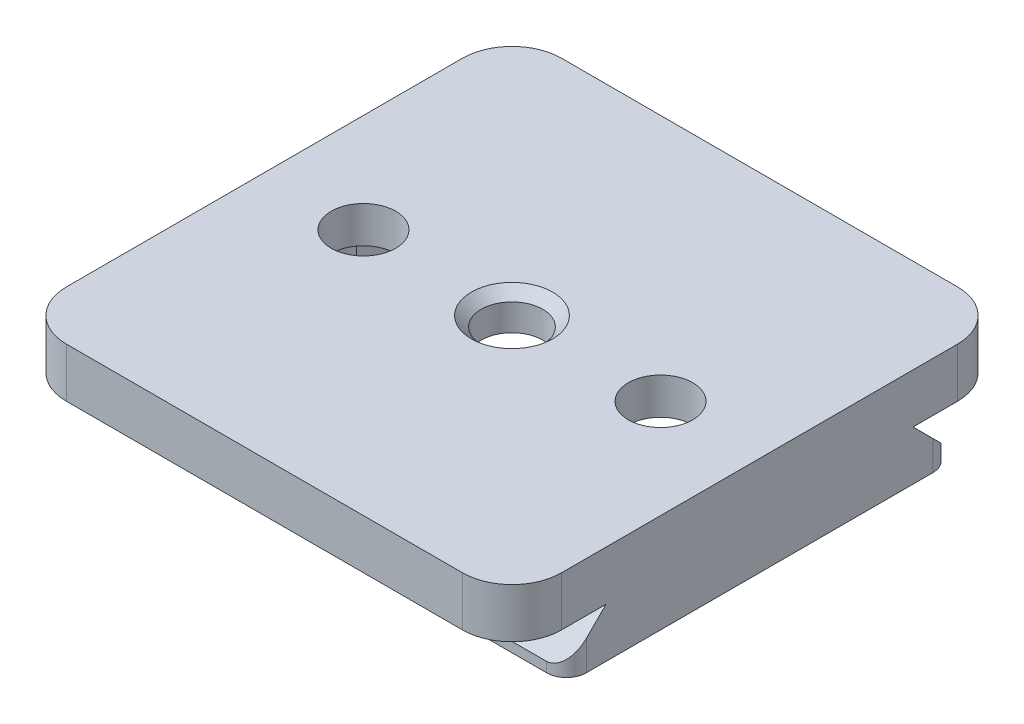
ISO-10303-21;
HEADER;
FILE_DESCRIPTION(('STEP AP214'),'2;1');
FILE_NAME('part.step','',(''),(''),'','','');
FILE_SCHEMA(('AUTOMOTIVE_DESIGN { 1 0 10303 214 1 1 1 1 }'));
ENDSEC;
DATA;
#1=APPLICATION_CONTEXT('core data for automotive mechanical design processes');
#2=APPLICATION_PROTOCOL_DEFINITION('international standard','automotive_design',2000,#1);
#3=PRODUCT_CONTEXT('',#1,'mechanical');
#4=PRODUCT('Part','Part','',(#3));
#5=PRODUCT_RELATED_PRODUCT_CATEGORY('part','',(#4));
#6=PRODUCT_DEFINITION_FORMATION('','',#4);
#7=PRODUCT_DEFINITION_CONTEXT('part definition',#1,'design');
#8=PRODUCT_DEFINITION('design','',#6,#7);
#9=PRODUCT_DEFINITION_SHAPE('','',#8);
#10=(LENGTH_UNIT() NAMED_UNIT(*) SI_UNIT(.MILLI.,.METRE.));
#11=(NAMED_UNIT(*) PLANE_ANGLE_UNIT() SI_UNIT($,.RADIAN.));
#12=(NAMED_UNIT(*) SI_UNIT($,.STERADIAN.) SOLID_ANGLE_UNIT());
#13=UNCERTAINTY_MEASURE_WITH_UNIT(LENGTH_MEASURE(1.E-05),#10,'distance_accuracy_value','');
#14=(GEOMETRIC_REPRESENTATION_CONTEXT(3) GLOBAL_UNCERTAINTY_ASSIGNED_CONTEXT((#13)) GLOBAL_UNIT_ASSIGNED_CONTEXT((#10,
#11,#12)) REPRESENTATION_CONTEXT('',''));
#15=CARTESIAN_POINT('',(0.,0.,0.));
#16=DIRECTION('',(0.,0.,1.));
#17=DIRECTION('',(1.,0.,0.));
#18=AXIS2_PLACEMENT_3D('',#15,#16,#17);
#19=CARTESIAN_POINT('',(21.,6.3,7.22841614740048));
#20=DIRECTION('',(1.,0.,0.));
#21=DIRECTION('',(0.,0.,-1.));
#22=AXIS2_PLACEMENT_3D('',#19,#20,#21);
#23=PLANE('',#22);
#24=DIRECTION('',(0.,1.,0.));
#25=VECTOR('',#24,1.);
#26=CARTESIAN_POINT('',(21.,-3.7,-5.29150262212918));
#27=LINE('',#26,#25);
#28=CARTESIAN_POINT('',(21.,6.3,-5.29150262212918));
#29=VERTEX_POINT('',#28);
#30=CARTESIAN_POINT('',(21.,0.,-5.29150262212919));
#31=VERTEX_POINT('',#30);
#32=EDGE_CURVE('E11',#29,#31,#27,.F.);
#33=ORIENTED_EDGE('',*,*,#32,.F.);
#34=DIRECTION('',(0.,0.,1.));
#35=VECTOR('',#34,1.);
#36=CARTESIAN_POINT('',(21.,6.3,-10.5));
#37=LINE('',#36,#35);
#38=CARTESIAN_POINT('',(21.,6.3,-10.5));
#39=VERTEX_POINT('',#38);
#40=EDGE_CURVE('E263',#39,#29,#37,.T.);
#41=ORIENTED_EDGE('',*,*,#40,.F.);
#42=DIRECTION('',(0.,-1.,0.));
#43=VECTOR('',#42,1.);
#44=CARTESIAN_POINT('',(21.,6.3,-10.5));
#45=LINE('',#44,#43);
#46=CARTESIAN_POINT('',(21.,0.,-10.5));
#47=VERTEX_POINT('',#46);
#48=EDGE_CURVE('E295',#39,#47,#45,.T.);
#49=ORIENTED_EDGE('',*,*,#48,.T.);
#50=DIRECTION('',(0.,0.,1.));
#51=VECTOR('',#50,1.);
#52=CARTESIAN_POINT('',(21.,0.,-10.5));
#53=LINE('',#52,#51);
#54=EDGE_CURVE('E287',#47,#31,#53,.T.);
#55=ORIENTED_EDGE('',*,*,#54,.T.);
#56=EDGE_LOOP('',(#33,#41,#49,#55));
#57=FACE_BOUND('',#56,.T.);
#58=ADVANCED_FACE('F33',(#57),#23,.F.);
#59=DIRECTION('',(0.,1.,0.));
#60=VECTOR('',#59,1.);
#61=CARTESIAN_POINT('',(21.,-3.7,5.29150262212918));
#62=LINE('',#61,#60);
#63=CARTESIAN_POINT('',(21.,0.,5.29150262212918));
#64=VERTEX_POINT('',#63);
#65=CARTESIAN_POINT('',(21.,6.3,5.29150262212918));
#66=VERTEX_POINT('',#65);
#67=EDGE_CURVE('E41',#64,#66,#62,.T.);
#68=ORIENTED_EDGE('',*,*,#67,.F.);
#69=CARTESIAN_POINT('',(21.,0.,10.5));
#70=VERTEX_POINT('',#69);
#71=EDGE_CURVE('E286',#64,#70,#53,.T.);
#72=ORIENTED_EDGE('',*,*,#71,.T.);
#73=DIRECTION('',(0.,-1.,0.));
#74=VECTOR('',#73,1.);
#75=CARTESIAN_POINT('',(21.,6.3,10.5));
#76=LINE('',#75,#74);
#77=CARTESIAN_POINT('',(21.,6.3,10.5));
#78=VERTEX_POINT('',#77);
#79=EDGE_CURVE('E291',#78,#70,#76,.T.);
#80=ORIENTED_EDGE('',*,*,#79,.F.);
#81=EDGE_CURVE('E262',#66,#78,#37,.T.);
#82=ORIENTED_EDGE('',*,*,#81,.F.);
#83=EDGE_LOOP('',(#68,#72,#80,#82));
#84=FACE_BOUND('',#83,.T.);
#85=ADVANCED_FACE('F432',(#84),#23,.F.);
#86=CARTESIAN_POINT('',(-21.,6.3,-10.5));
#87=DIRECTION('',(-1.,0.,0.));
#88=DIRECTION('',(0.,0.,1.));
#89=AXIS2_PLACEMENT_3D('',#86,#87,#88);
#90=PLANE('',#89);
#91=DIRECTION('',(0.,1.,0.));
#92=VECTOR('',#91,1.);
#93=CARTESIAN_POINT('',(-21.,-3.7,5.29150262212917));
#94=LINE('',#93,#92);
#95=CARTESIAN_POINT('',(-21.,6.3,5.29150262212917));
#96=VERTEX_POINT('',#95);
#97=CARTESIAN_POINT('',(-21.,0.,5.29150262212918));
#98=VERTEX_POINT('',#97);
#99=EDGE_CURVE('E228',#96,#98,#94,.F.);
#100=ORIENTED_EDGE('',*,*,#99,.F.);
#101=DIRECTION('',(0.,0.,-1.));
#102=VECTOR('',#101,1.);
#103=CARTESIAN_POINT('',(-21.,6.3,7.22841614740048));
#104=LINE('',#103,#102);
#105=CARTESIAN_POINT('',(-21.,6.3,10.5));
#106=VERTEX_POINT('',#105);
#107=EDGE_CURVE('E238',#106,#96,#104,.T.);
#108=ORIENTED_EDGE('',*,*,#107,.F.);
#109=DIRECTION('',(0.,-1.,0.));
#110=VECTOR('',#109,1.);
#111=CARTESIAN_POINT('',(-21.,6.3,10.5));
#112=LINE('',#111,#110);
#113=CARTESIAN_POINT('',(-21.,0.,10.5));
#114=VERTEX_POINT('',#113);
#115=EDGE_CURVE('E304',#106,#114,#112,.T.);
#116=ORIENTED_EDGE('',*,*,#115,.T.);
#117=DIRECTION('',(0.,0.,-1.));
#118=VECTOR('',#117,1.);
#119=CARTESIAN_POINT('',(-21.,0.,7.22841614740048));
#120=LINE('',#119,#118);
#121=EDGE_CURVE('E241',#114,#98,#120,.T.);
#122=ORIENTED_EDGE('',*,*,#121,.T.);
#123=EDGE_LOOP('',(#100,#108,#116,#122));
#124=FACE_BOUND('',#123,.T.);
#125=ADVANCED_FACE('F237',(#124),#90,.F.);
#126=DIRECTION('',(0.,1.,0.));
#127=VECTOR('',#126,1.);
#128=CARTESIAN_POINT('',(-21.,-3.7,-5.29150262212918));
#129=LINE('',#128,#127);
#130=CARTESIAN_POINT('',(-21.,0.,-5.29150262212918));
#131=VERTEX_POINT('',#130);
#132=CARTESIAN_POINT('',(-21.,6.3,-5.29150262212918));
#133=VERTEX_POINT('',#132);
#134=EDGE_CURVE('E231',#131,#133,#129,.T.);
#135=ORIENTED_EDGE('',*,*,#134,.F.);
#136=CARTESIAN_POINT('',(-21.,0.,-10.5));
#137=VERTEX_POINT('',#136);
#138=EDGE_CURVE('E275',#131,#137,#120,.T.);
#139=ORIENTED_EDGE('',*,*,#138,.T.);
#140=DIRECTION('',(0.,-1.,0.));
#141=VECTOR('',#140,1.);
#142=CARTESIAN_POINT('',(-21.,6.3,-10.5));
#143=LINE('',#142,#141);
#144=CARTESIAN_POINT('',(-21.,6.3,-10.5));
#145=VERTEX_POINT('',#144);
#146=EDGE_CURVE('E301',#145,#137,#143,.T.);
#147=ORIENTED_EDGE('',*,*,#146,.F.);
#148=EDGE_CURVE('E249',#133,#145,#104,.T.);
#149=ORIENTED_EDGE('',*,*,#148,.F.);
#150=EDGE_LOOP('',(#135,#139,#147,#149));
#151=FACE_BOUND('',#150,.T.);
#152=ADVANCED_FACE('F487',(#151),#90,.F.);
#153=CARTESIAN_POINT('',(18.5,6.3,10.5));
#154=DIRECTION('',(0.,-1.,0.));
#155=DIRECTION('',(0.,0.,-1.));
#156=AXIS2_PLACEMENT_3D('',#153,#154,#155);
#157=PLANE('',#156);
#158=CARTESIAN_POINT('',(0.,6.3,0.));
#159=DIRECTION('',(0.,-1.,0.));
#160=DIRECTION('',(0.,0.,-1.));
#161=AXIS2_PLACEMENT_3D('',#158,#159,#160);
#162=CIRCLE('',#161,3.1);
#163=CARTESIAN_POINT('',(0.,6.3,-3.1));
#164=VERTEX_POINT('',#163);
#165=EDGE_CURVE('E417',#164,#164,#162,.T.);
#166=ORIENTED_EDGE('',*,*,#165,.F.);
#167=EDGE_LOOP('',(#166));
#168=FACE_BOUND('',#167,.T.);
#169=ORIENTED_EDGE('',*,*,#40,.T.);
#170=CARTESIAN_POINT('',(15.,6.3,0.));
#171=DIRECTION('',(0.,-1.,0.));
#172=DIRECTION('',(0.,0.,-1.));
#173=AXIS2_PLACEMENT_3D('',#170,#171,#172);
#174=CIRCLE('',#173,8.);
#175=EDGE_CURVE('E48',#29,#66,#174,.T.);
#176=ORIENTED_EDGE('',*,*,#175,.T.);
#177=ORIENTED_EDGE('',*,*,#81,.T.);
#178=CARTESIAN_POINT('',(18.5,6.3,10.5));
#179=DIRECTION('',(0.,-1.,0.));
#180=DIRECTION('',(0.,0.,-1.));
#181=AXIS2_PLACEMENT_3D('',#178,#179,#180);
#182=CIRCLE('',#181,2.5);
#183=CARTESIAN_POINT('',(18.5,6.3,13.));
#184=VERTEX_POINT('',#183);
#185=EDGE_CURVE('E290',#78,#184,#182,.T.);
#186=ORIENTED_EDGE('',*,*,#185,.T.);
#187=DIRECTION('',(-1.,0.,0.));
#188=VECTOR('',#187,1.);
#189=CARTESIAN_POINT('',(18.5,6.3,13.));
#190=LINE('',#189,#188);
#191=CARTESIAN_POINT('',(-18.5,6.3,13.));
#192=VERTEX_POINT('',#191);
#193=EDGE_CURVE('E436',#184,#192,#190,.T.);
#194=ORIENTED_EDGE('',*,*,#193,.T.);
#195=CARTESIAN_POINT('',(-18.5,6.3,10.5));
#196=DIRECTION('',(0.,-1.,0.));
#197=DIRECTION('',(0.,0.,-1.));
#198=AXIS2_PLACEMENT_3D('',#195,#196,#197);
#199=CIRCLE('',#198,2.5);
#200=EDGE_CURVE('E247',#192,#106,#199,.T.);
#201=ORIENTED_EDGE('',*,*,#200,.T.);
#202=ORIENTED_EDGE('',*,*,#107,.T.);
#203=CARTESIAN_POINT('',(-15.,6.3,0.));
#204=DIRECTION('',(0.,-1.,0.));
#205=DIRECTION('',(0.,0.,-1.));
#206=AXIS2_PLACEMENT_3D('',#203,#204,#205);
#207=CIRCLE('',#206,8.);
#208=EDGE_CURVE('E55',#96,#133,#207,.T.);
#209=ORIENTED_EDGE('',*,*,#208,.T.);
#210=ORIENTED_EDGE('',*,*,#148,.T.);
#211=CARTESIAN_POINT('',(-18.5,6.3,-10.5));
#212=DIRECTION('',(0.,-1.,0.));
#213=DIRECTION('',(0.,0.,1.));
#214=AXIS2_PLACEMENT_3D('',#211,#212,#213);
#215=CIRCLE('',#214,2.5);
#216=CARTESIAN_POINT('',(-18.5,6.3,-13.));
#217=VERTEX_POINT('',#216);
#218=EDGE_CURVE('E248',#145,#217,#215,.T.);
#219=ORIENTED_EDGE('',*,*,#218,.T.);
#220=DIRECTION('',(1.,0.,0.));
#221=VECTOR('',#220,1.);
#222=CARTESIAN_POINT('',(18.5,6.3,-13.));
#223=LINE('',#222,#221);
#224=CARTESIAN_POINT('',(18.5,6.3,-13.));
#225=VERTEX_POINT('',#224);
#226=EDGE_CURVE('E252',#217,#225,#223,.T.);
#227=ORIENTED_EDGE('',*,*,#226,.T.);
#228=CARTESIAN_POINT('',(18.5,6.3,-10.5));
#229=DIRECTION('',(0.,-1.,0.));
#230=DIRECTION('',(0.,0.,-1.));
#231=AXIS2_PLACEMENT_3D('',#228,#229,#230);
#232=CIRCLE('',#231,2.5);
#233=EDGE_CURVE('E259',#225,#39,#232,.T.);
#234=ORIENTED_EDGE('',*,*,#233,.T.);
#235=EDGE_LOOP('',(#169,#176,#177,#186,#194,#201,#202,#209,#210,#219,#227,#234));
#236=FACE_BOUND('',#235,.T.);
#237=CARTESIAN_POINT('',(-15.,6.3,0.));
#238=DIRECTION('',(0.,-1.,0.));
#239=DIRECTION('',(0.,0.,-1.));
#240=AXIS2_PLACEMENT_3D('',#237,#238,#239);
#241=CIRCLE('',#240,3.25);
#242=CARTESIAN_POINT('',(-15.,6.3,-3.25));
#243=VERTEX_POINT('',#242);
#244=EDGE_CURVE('E475',#243,#243,#241,.T.);
#245=ORIENTED_EDGE('',*,*,#244,.F.);
#246=EDGE_LOOP('',(#245));
#247=FACE_BOUND('',#246,.T.);
#248=CARTESIAN_POINT('',(15.,6.3,0.));
#249=DIRECTION('',(0.,-1.,0.));
#250=DIRECTION('',(0.,0.,-1.));
#251=AXIS2_PLACEMENT_3D('',#248,#249,#250);
#252=CIRCLE('',#251,3.25);
#253=CARTESIAN_POINT('',(15.,6.3,-3.25));
#254=VERTEX_POINT('',#253);
#255=EDGE_CURVE('E476',#254,#254,#252,.T.);
#256=ORIENTED_EDGE('',*,*,#255,.F.);
#257=EDGE_LOOP('',(#256));
#258=FACE_BOUND('',#257,.T.);
#259=ADVANCED_FACE('F243',(#168,#236,#247,#258),#157,.T.);
#260=CARTESIAN_POINT('',(0.,5.8,0.));
#261=DIRECTION('',(0.,1.,0.));
#262=DIRECTION('',(0.,0.,1.));
#263=AXIS2_PLACEMENT_3D('',#260,#261,#262);
#264=CYLINDRICAL_SURFACE('',#263,3.1);
#265=CARTESIAN_POINT('',(0.,8.99999999999999,0.));
#266=DIRECTION('',(0.,1.,0.));
#267=DIRECTION('',(0.,0.,1.));
#268=AXIS2_PLACEMENT_3D('',#265,#266,#267);
#269=CIRCLE('',#268,3.1);
#270=CARTESIAN_POINT('',(0.,8.99999999999999,3.1));
#271=VERTEX_POINT('',#270);
#272=EDGE_CURVE('E414',#271,#271,#269,.T.);
#273=ORIENTED_EDGE('',*,*,#272,.T.);
#274=EDGE_LOOP('',(#273));
#275=FACE_BOUND('',#274,.T.);
#276=ORIENTED_EDGE('',*,*,#165,.T.);
#277=EDGE_LOOP('',(#276));
#278=FACE_BOUND('',#277,.T.);
#279=ADVANCED_FACE('F542',(#275,#278),#264,.F.);
#280=CARTESIAN_POINT('',(-25.,10.,25.));
#281=DIRECTION('',(1.,0.,0.));
#282=DIRECTION('',(0.,0.,-1.));
#283=AXIS2_PLACEMENT_3D('',#280,#281,#282);
#284=PLANE('',#283);
#285=DIRECTION('',(0.,0.,1.));
#286=VECTOR('',#285,1.);
#287=CARTESIAN_POINT('',(-25.,0.,25.));
#288=LINE('',#287,#286);
#289=CARTESIAN_POINT('',(-25.,0.,-17.5));
#290=VERTEX_POINT('',#289);
#291=CARTESIAN_POINT('',(-25.,0.,17.5));
#292=VERTEX_POINT('',#291);
#293=EDGE_CURVE('E294',#290,#292,#288,.T.);
#294=ORIENTED_EDGE('',*,*,#293,.T.);
#295=DIRECTION('',(0.,-1.,0.));
#296=VECTOR('',#295,1.);
#297=CARTESIAN_POINT('',(-25.,1.00000000000001,17.5));
#298=LINE('',#297,#296);
#299=CARTESIAN_POINT('',(-25.,3.00000000000002,17.5));
#300=VERTEX_POINT('',#299);
#301=EDGE_CURVE('E408',#292,#300,#298,.F.);
#302=ORIENTED_EDGE('',*,*,#301,.T.);
#303=DIRECTION('',(0.,0.707106781186549,-0.707106781186546));
#304=VECTOR('',#303,1.);
#305=CARTESIAN_POINT('',(-25.,0.,20.5));
#306=LINE('',#305,#304);
#307=CARTESIAN_POINT('',(-25.,5.,15.5));
#308=VERTEX_POINT('',#307);
#309=EDGE_CURVE('E465',#300,#308,#306,.T.);
#310=ORIENTED_EDGE('',*,*,#309,.T.);
#311=DIRECTION('',(0.,0.,1.));
#312=VECTOR('',#311,1.);
#313=CARTESIAN_POINT('',(-25.,5.,25.));
#314=LINE('',#313,#312);
#315=CARTESIAN_POINT('',(-25.,5.,20.));
#316=VERTEX_POINT('',#315);
#317=EDGE_CURVE('E459',#308,#316,#314,.T.);
#318=ORIENTED_EDGE('',*,*,#317,.T.);
#319=DIRECTION('',(0.,-1.,0.));
#320=VECTOR('',#319,1.);
#321=CARTESIAN_POINT('',(-25.,10.,20.));
#322=LINE('',#321,#320);
#323=CARTESIAN_POINT('',(-25.,10.,20.));
#324=VERTEX_POINT('',#323);
#325=EDGE_CURVE('E347',#316,#324,#322,.F.);
#326=ORIENTED_EDGE('',*,*,#325,.T.);
#327=DIRECTION('',(0.,0.,1.));
#328=VECTOR('',#327,1.);
#329=CARTESIAN_POINT('',(-25.,10.,25.));
#330=LINE('',#329,#328);
#331=CARTESIAN_POINT('',(-25.,10.,-20.));
#332=VERTEX_POINT('',#331);
#333=EDGE_CURVE('E310',#332,#324,#330,.T.);
#334=ORIENTED_EDGE('',*,*,#333,.F.);
#335=DIRECTION('',(0.,-1.,0.));
#336=VECTOR('',#335,1.);
#337=CARTESIAN_POINT('',(-25.,10.,-20.));
#338=LINE('',#337,#336);
#339=CARTESIAN_POINT('',(-25.,5.,-20.));
#340=VERTEX_POINT('',#339);
#341=EDGE_CURVE('E349',#332,#340,#338,.T.);
#342=ORIENTED_EDGE('',*,*,#341,.T.);
#343=DIRECTION('',(0.,0.,1.));
#344=VECTOR('',#343,1.);
#345=CARTESIAN_POINT('',(-25.,5.,-15.5));
#346=LINE('',#345,#344);
#347=CARTESIAN_POINT('',(-25.,5.,-15.5));
#348=VERTEX_POINT('',#347);
#349=EDGE_CURVE('E451',#340,#348,#346,.T.);
#350=ORIENTED_EDGE('',*,*,#349,.T.);
#351=DIRECTION('',(0.,-0.707106781186549,-0.707106781186546));
#352=VECTOR('',#351,1.);
#353=CARTESIAN_POINT('',(-25.,0.,-20.5));
#354=LINE('',#353,#352);
#355=CARTESIAN_POINT('',(-25.,3.00000000000002,-17.5));
#356=VERTEX_POINT('',#355);
#357=EDGE_CURVE('E444',#348,#356,#354,.T.);
#358=ORIENTED_EDGE('',*,*,#357,.T.);
#359=DIRECTION('',(0.,1.,0.));
#360=VECTOR('',#359,1.);
#361=CARTESIAN_POINT('',(-25.,0.,-17.5));
#362=LINE('',#361,#360);
#363=EDGE_CURVE('E405',#356,#290,#362,.F.);
#364=ORIENTED_EDGE('',*,*,#363,.T.);
#365=EDGE_LOOP('',(#294,#302,#310,#318,#326,#334,#342,#350,#358,#364));
#366=FACE_BOUND('',#365,.T.);
#367=ADVANCED_FACE('F547',(#366),#284,.F.);
#368=CARTESIAN_POINT('',(25.,10.,25.));
#369=DIRECTION('',(0.,0.,-1.));
#370=DIRECTION('',(-1.,0.,0.));
#371=AXIS2_PLACEMENT_3D('',#368,#369,#370);
#372=PLANE('',#371);
#373=DIRECTION('',(1.,0.,0.));
#374=VECTOR('',#373,1.);
#375=CARTESIAN_POINT('',(25.,10.,25.));
#376=LINE('',#375,#374);
#377=CARTESIAN_POINT('',(-20.,10.,25.));
#378=VERTEX_POINT('',#377);
#379=CARTESIAN_POINT('',(20.,10.,25.));
#380=VERTEX_POINT('',#379);
#381=EDGE_CURVE('E313',#378,#380,#376,.T.);
#382=ORIENTED_EDGE('',*,*,#381,.F.);
#383=DIRECTION('',(0.,-1.,0.));
#384=VECTOR('',#383,1.);
#385=CARTESIAN_POINT('',(-20.,10.,25.));
#386=LINE('',#385,#384);
#387=CARTESIAN_POINT('',(-20.,5.,25.));
#388=VERTEX_POINT('',#387);
#389=EDGE_CURVE('E354',#378,#388,#386,.T.);
#390=ORIENTED_EDGE('',*,*,#389,.T.);
#391=DIRECTION('',(1.,0.,0.));
#392=VECTOR('',#391,1.);
#393=CARTESIAN_POINT('',(-25.,5.,25.));
#394=LINE('',#393,#392);
#395=CARTESIAN_POINT('',(20.,5.,25.));
#396=VERTEX_POINT('',#395);
#397=EDGE_CURVE('E269',#388,#396,#394,.T.);
#398=ORIENTED_EDGE('',*,*,#397,.T.);
#399=DIRECTION('',(0.,-1.,0.));
#400=VECTOR('',#399,1.);
#401=CARTESIAN_POINT('',(20.,10.,25.));
#402=LINE('',#401,#400);
#403=EDGE_CURVE('E352',#396,#380,#402,.F.);
#404=ORIENTED_EDGE('',*,*,#403,.T.);
#405=EDGE_LOOP('',(#382,#390,#398,#404));
#406=FACE_BOUND('',#405,.T.);
#407=ADVANCED_FACE('F554',(#406),#372,.F.);
#408=CARTESIAN_POINT('',(25.,10.,25.));
#409=DIRECTION('',(-1.,0.,0.));
#410=DIRECTION('',(0.,0.,1.));
#411=AXIS2_PLACEMENT_3D('',#408,#409,#410);
#412=PLANE('',#411);
#413=DIRECTION('',(0.,0.,-1.));
#414=VECTOR('',#413,1.);
#415=CARTESIAN_POINT('',(25.,0.,25.));
#416=LINE('',#415,#414);
#417=CARTESIAN_POINT('',(25.,0.,17.5));
#418=VERTEX_POINT('',#417);
#419=CARTESIAN_POINT('',(25.,0.,-17.5));
#420=VERTEX_POINT('',#419);
#421=EDGE_CURVE('E314',#418,#420,#416,.T.);
#422=ORIENTED_EDGE('',*,*,#421,.T.);
#423=DIRECTION('',(0.,-1.,0.));
#424=VECTOR('',#423,1.);
#425=CARTESIAN_POINT('',(25.,1.00000000000001,-17.5));
#426=LINE('',#425,#424);
#427=CARTESIAN_POINT('',(25.,3.00000000000002,-17.5));
#428=VERTEX_POINT('',#427);
#429=EDGE_CURVE('E376',#420,#428,#426,.F.);
#430=ORIENTED_EDGE('',*,*,#429,.T.);
#431=DIRECTION('',(0.,-0.707106781186549,-0.707106781186546));
#432=VECTOR('',#431,1.);
#433=CARTESIAN_POINT('',(25.,0.,-20.5));
#434=LINE('',#433,#432);
#435=CARTESIAN_POINT('',(25.,5.,-15.5));
#436=VERTEX_POINT('',#435);
#437=EDGE_CURVE('E448',#436,#428,#434,.T.);
#438=ORIENTED_EDGE('',*,*,#437,.F.);
#439=DIRECTION('',(0.,0.,1.));
#440=VECTOR('',#439,1.);
#441=CARTESIAN_POINT('',(25.,5.,-15.5));
#442=LINE('',#441,#440);
#443=CARTESIAN_POINT('',(25.,5.,-20.));
#444=VERTEX_POINT('',#443);
#445=EDGE_CURVE('E420',#444,#436,#442,.T.);
#446=ORIENTED_EDGE('',*,*,#445,.F.);
#447=DIRECTION('',(0.,-1.,0.));
#448=VECTOR('',#447,1.);
#449=CARTESIAN_POINT('',(25.,10.,-20.));
#450=LINE('',#449,#448);
#451=CARTESIAN_POINT('',(25.,10.,-20.));
#452=VERTEX_POINT('',#451);
#453=EDGE_CURVE('E337',#444,#452,#450,.F.);
#454=ORIENTED_EDGE('',*,*,#453,.T.);
#455=DIRECTION('',(0.,0.,-1.));
#456=VECTOR('',#455,1.);
#457=CARTESIAN_POINT('',(25.,10.,25.));
#458=LINE('',#457,#456);
#459=CARTESIAN_POINT('',(25.,10.,20.));
#460=VERTEX_POINT('',#459);
#461=EDGE_CURVE('E317',#460,#452,#458,.T.);
#462=ORIENTED_EDGE('',*,*,#461,.F.);
#463=DIRECTION('',(0.,-1.,0.));
#464=VECTOR('',#463,1.);
#465=CARTESIAN_POINT('',(25.,10.,20.));
#466=LINE('',#465,#464);
#467=CARTESIAN_POINT('',(25.,5.,20.));
#468=VERTEX_POINT('',#467);
#469=EDGE_CURVE('E334',#460,#468,#466,.T.);
#470=ORIENTED_EDGE('',*,*,#469,.T.);
#471=DIRECTION('',(0.,0.,1.));
#472=VECTOR('',#471,1.);
#473=CARTESIAN_POINT('',(25.,5.,25.));
#474=LINE('',#473,#472);
#475=CARTESIAN_POINT('',(25.,5.,15.5));
#476=VERTEX_POINT('',#475);
#477=EDGE_CURVE('E462',#476,#468,#474,.T.);
#478=ORIENTED_EDGE('',*,*,#477,.F.);
#479=DIRECTION('',(0.,0.707106781186549,-0.707106781186546));
#480=VECTOR('',#479,1.);
#481=CARTESIAN_POINT('',(25.,0.,20.5));
#482=LINE('',#481,#480);
#483=CARTESIAN_POINT('',(25.,3.00000000000002,17.5));
#484=VERTEX_POINT('',#483);
#485=EDGE_CURVE('E447',#484,#476,#482,.T.);
#486=ORIENTED_EDGE('',*,*,#485,.F.);
#487=DIRECTION('',(0.,1.,0.));
#488=VECTOR('',#487,1.);
#489=CARTESIAN_POINT('',(25.,0.,17.5));
#490=LINE('',#489,#488);
#491=EDGE_CURVE('E373',#484,#418,#490,.F.);
#492=ORIENTED_EDGE('',*,*,#491,.T.);
#493=EDGE_LOOP('',(#422,#430,#438,#446,#454,#462,#470,#478,#486,#492));
#494=FACE_BOUND('',#493,.T.);
#495=ADVANCED_FACE('F718',(#494),#412,.F.);
#496=CARTESIAN_POINT('',(25.,10.,-25.));
#497=DIRECTION('',(0.,0.,1.));
#498=DIRECTION('',(1.,0.,0.));
#499=AXIS2_PLACEMENT_3D('',#496,#497,#498);
#500=PLANE('',#499);
#501=DIRECTION('',(-1.,0.,0.));
#502=VECTOR('',#501,1.);
#503=CARTESIAN_POINT('',(25.,10.,-25.));
#504=LINE('',#503,#502);
#505=CARTESIAN_POINT('',(20.,10.,-25.));
#506=VERTEX_POINT('',#505);
#507=CARTESIAN_POINT('',(-20.,10.,-25.));
#508=VERTEX_POINT('',#507);
#509=EDGE_CURVE('E320',#506,#508,#504,.T.);
#510=ORIENTED_EDGE('',*,*,#509,.F.);
#511=DIRECTION('',(0.,-1.,0.));
#512=VECTOR('',#511,1.);
#513=CARTESIAN_POINT('',(20.,10.,-25.));
#514=LINE('',#513,#512);
#515=CARTESIAN_POINT('',(20.,5.,-25.));
#516=VERTEX_POINT('',#515);
#517=EDGE_CURVE('E327',#506,#516,#514,.T.);
#518=ORIENTED_EDGE('',*,*,#517,.T.);
#519=DIRECTION('',(1.,0.,0.));
#520=VECTOR('',#519,1.);
#521=CARTESIAN_POINT('',(-25.,5.,-25.));
#522=LINE('',#521,#520);
#523=CARTESIAN_POINT('',(-20.,5.,-25.));
#524=VERTEX_POINT('',#523);
#525=EDGE_CURVE('E443',#524,#516,#522,.T.);
#526=ORIENTED_EDGE('',*,*,#525,.F.);
#527=DIRECTION('',(0.,-1.,0.));
#528=VECTOR('',#527,1.);
#529=CARTESIAN_POINT('',(-20.,10.,-25.));
#530=LINE('',#529,#528);
#531=EDGE_CURVE('E323',#524,#508,#530,.F.);
#532=ORIENTED_EDGE('',*,*,#531,.T.);
#533=EDGE_LOOP('',(#510,#518,#526,#532));
#534=FACE_BOUND('',#533,.T.);
#535=ADVANCED_FACE('F727',(#534),#500,.F.);
#536=CARTESIAN_POINT('',(0.,10.,0.));
#537=DIRECTION('',(0.,1.,0.));
#538=DIRECTION('',(0.,0.,1.));
#539=AXIS2_PLACEMENT_3D('',#536,#537,#538);
#540=PLANE('',#539);
#541=CARTESIAN_POINT('',(-15.,10.,0.));
#542=DIRECTION('',(0.,1.,0.));
#543=DIRECTION('',(0.,0.,1.));
#544=AXIS2_PLACEMENT_3D('',#541,#542,#543);
#545=CIRCLE('',#544,3.25);
#546=CARTESIAN_POINT('',(-15.,10.,3.25));
#547=VERTEX_POINT('',#546);
#548=EDGE_CURVE('E421',#547,#547,#545,.T.);
#549=ORIENTED_EDGE('',*,*,#548,.F.);
#550=EDGE_LOOP('',(#549));
#551=FACE_BOUND('',#550,.T.);
#552=CARTESIAN_POINT('',(15.,10.,0.));
#553=DIRECTION('',(0.,1.,0.));
#554=DIRECTION('',(0.,0.,1.));
#555=AXIS2_PLACEMENT_3D('',#552,#553,#554);
#556=CIRCLE('',#555,3.25);
#557=CARTESIAN_POINT('',(15.,10.,3.25));
#558=VERTEX_POINT('',#557);
#559=EDGE_CURVE('E472',#558,#558,#556,.T.);
#560=ORIENTED_EDGE('',*,*,#559,.F.);
#561=EDGE_LOOP('',(#560));
#562=FACE_BOUND('',#561,.T.);
#563=CARTESIAN_POINT('',(0.,10.,0.));
#564=DIRECTION('',(0.,1.,0.));
#565=DIRECTION('',(0.,0.,1.));
#566=AXIS2_PLACEMENT_3D('',#563,#564,#565);
#567=CIRCLE('',#566,4.10000000000001);
#568=CARTESIAN_POINT('',(0.,10.,4.10000000000001));
#569=VERTEX_POINT('',#568);
#570=EDGE_CURVE('E411',#569,#569,#567,.F.);
#571=ORIENTED_EDGE('',*,*,#570,.T.);
#572=EDGE_LOOP('',(#571));
#573=FACE_BOUND('',#572,.T.);
#574=ORIENTED_EDGE('',*,*,#461,.T.);
#575=CARTESIAN_POINT('',(20.,10.,-20.));
#576=DIRECTION('',(0.,1.,0.));
#577=DIRECTION('',(0.,0.,1.));
#578=AXIS2_PLACEMENT_3D('',#575,#576,#577);
#579=CIRCLE('',#578,5.);
#580=EDGE_CURVE('E345',#452,#506,#579,.T.);
#581=ORIENTED_EDGE('',*,*,#580,.T.);
#582=ORIENTED_EDGE('',*,*,#509,.T.);
#583=CARTESIAN_POINT('',(-20.,10.,-20.));
#584=DIRECTION('',(0.,1.,0.));
#585=DIRECTION('',(0.,0.,1.));
#586=AXIS2_PLACEMENT_3D('',#583,#584,#585);
#587=CIRCLE('',#586,5.);
#588=EDGE_CURVE('E343',#508,#332,#587,.T.);
#589=ORIENTED_EDGE('',*,*,#588,.T.);
#590=ORIENTED_EDGE('',*,*,#333,.T.);
#591=CARTESIAN_POINT('',(-20.,10.,20.));
#592=DIRECTION('',(0.,1.,0.));
#593=DIRECTION('',(0.,0.,1.));
#594=AXIS2_PLACEMENT_3D('',#591,#592,#593);
#595=CIRCLE('',#594,5.);
#596=EDGE_CURVE('E341',#324,#378,#595,.T.);
#597=ORIENTED_EDGE('',*,*,#596,.T.);
#598=ORIENTED_EDGE('',*,*,#381,.T.);
#599=CARTESIAN_POINT('',(20.,10.,20.));
#600=DIRECTION('',(0.,1.,0.));
#601=DIRECTION('',(0.,0.,1.));
#602=AXIS2_PLACEMENT_3D('',#599,#600,#601);
#603=CIRCLE('',#602,5.);
#604=EDGE_CURVE('E339',#380,#460,#603,.T.);
#605=ORIENTED_EDGE('',*,*,#604,.T.);
#606=EDGE_LOOP('',(#574,#581,#582,#589,#590,#597,#598,#605));
#607=FACE_BOUND('',#606,.T.);
#608=ADVANCED_FACE('F731',(#551,#562,#573,#607),#540,.T.);
#609=CARTESIAN_POINT('',(0.,0.,0.));
#610=DIRECTION('',(0.,1.,0.));
#611=DIRECTION('',(0.,0.,1.));
#612=AXIS2_PLACEMENT_3D('',#609,#610,#611);
#613=PLANE('',#612);
#614=CARTESIAN_POINT('',(15.,0.,0.));
#615=DIRECTION('',(0.,1.,0.));
#616=DIRECTION('',(0.,0.,1.));
#617=AXIS2_PLACEMENT_3D('',#614,#615,#616);
#618=CIRCLE('',#617,8.);
#619=EDGE_CURVE('E428',#31,#64,#618,.F.);
#620=ORIENTED_EDGE('',*,*,#619,.F.);
#621=ORIENTED_EDGE('',*,*,#54,.F.);
#622=CARTESIAN_POINT('',(18.5,0.,-10.5));
#623=DIRECTION('',(0.,-1.,0.));
#624=DIRECTION('',(0.,0.,-1.));
#625=AXIS2_PLACEMENT_3D('',#622,#623,#624);
#626=CIRCLE('',#625,2.5);
#627=CARTESIAN_POINT('',(18.5,0.,-13.));
#628=VERTEX_POINT('',#627);
#629=EDGE_CURVE('E283',#628,#47,#626,.T.);
#630=ORIENTED_EDGE('',*,*,#629,.F.);
#631=DIRECTION('',(1.,0.,0.));
#632=VECTOR('',#631,1.);
#633=CARTESIAN_POINT('',(18.5,0.,-13.));
#634=LINE('',#633,#632);
#635=CARTESIAN_POINT('',(-18.5,0.,-13.));
#636=VERTEX_POINT('',#635);
#637=EDGE_CURVE('E280',#636,#628,#634,.T.);
#638=ORIENTED_EDGE('',*,*,#637,.F.);
#639=CARTESIAN_POINT('',(-18.5,0.,-10.5));
#640=DIRECTION('',(0.,-1.,0.));
#641=DIRECTION('',(0.,0.,1.));
#642=AXIS2_PLACEMENT_3D('',#639,#640,#641);
#643=CIRCLE('',#642,2.5);
#644=EDGE_CURVE('E277',#137,#636,#643,.T.);
#645=ORIENTED_EDGE('',*,*,#644,.F.);
#646=ORIENTED_EDGE('',*,*,#138,.F.);
#647=CARTESIAN_POINT('',(-15.,0.,0.));
#648=DIRECTION('',(0.,1.,0.));
#649=DIRECTION('',(0.,0.,1.));
#650=AXIS2_PLACEMENT_3D('',#647,#648,#649);
#651=CIRCLE('',#650,8.);
#652=EDGE_CURVE('E482',#98,#131,#651,.F.);
#653=ORIENTED_EDGE('',*,*,#652,.F.);
#654=ORIENTED_EDGE('',*,*,#121,.F.);
#655=CARTESIAN_POINT('',(-18.5,0.,10.5));
#656=DIRECTION('',(0.,-1.,0.));
#657=DIRECTION('',(0.,0.,-1.));
#658=AXIS2_PLACEMENT_3D('',#655,#656,#657);
#659=CIRCLE('',#658,2.5);
#660=CARTESIAN_POINT('',(-18.5,0.,13.));
#661=VERTEX_POINT('',#660);
#662=EDGE_CURVE('E272',#661,#114,#659,.T.);
#663=ORIENTED_EDGE('',*,*,#662,.F.);
#664=DIRECTION('',(-1.,0.,0.));
#665=VECTOR('',#664,1.);
#666=CARTESIAN_POINT('',(18.5,0.,13.));
#667=LINE('',#666,#665);
#668=CARTESIAN_POINT('',(18.5,0.,13.));
#669=VERTEX_POINT('',#668);
#670=EDGE_CURVE('E268',#669,#661,#667,.T.);
#671=ORIENTED_EDGE('',*,*,#670,.F.);
#672=CARTESIAN_POINT('',(18.5,0.,10.5));
#673=DIRECTION('',(0.,-1.,0.));
#674=DIRECTION('',(0.,0.,-1.));
#675=AXIS2_PLACEMENT_3D('',#672,#673,#674);
#676=CIRCLE('',#675,2.5);
#677=EDGE_CURVE('E266',#70,#669,#676,.T.);
#678=ORIENTED_EDGE('',*,*,#677,.F.);
#679=ORIENTED_EDGE('',*,*,#71,.F.);
#680=EDGE_LOOP('',(#620,#621,#630,#638,#645,#646,#653,#654,#663,#671,#678,#679));
#681=FACE_BOUND('',#680,.T.);
#682=CARTESIAN_POINT('',(-23.,0.,17.5));
#683=DIRECTION('',(0.,1.,0.));
#684=DIRECTION('',(0.,0.,1.));
#685=AXIS2_PLACEMENT_3D('',#682,#683,#684);
#686=CIRCLE('',#685,2.);
#687=CARTESIAN_POINT('',(-23.,0.,19.5));
#688=VERTEX_POINT('',#687);
#689=EDGE_CURVE('E389',#688,#292,#686,.F.);
#690=ORIENTED_EDGE('',*,*,#689,.T.);
#691=ORIENTED_EDGE('',*,*,#293,.F.);
#692=CARTESIAN_POINT('',(-23.,0.,-17.5));
#693=DIRECTION('',(0.,1.,0.));
#694=DIRECTION('',(0.,0.,1.));
#695=AXIS2_PLACEMENT_3D('',#692,#693,#694);
#696=CIRCLE('',#695,2.);
#697=CARTESIAN_POINT('',(-23.,0.,-19.5));
#698=VERTEX_POINT('',#697);
#699=EDGE_CURVE('E387',#290,#698,#696,.F.);
#700=ORIENTED_EDGE('',*,*,#699,.T.);
#701=DIRECTION('',(1.,0.,0.));
#702=VECTOR('',#701,1.);
#703=CARTESIAN_POINT('',(0.,0.,-19.5));
#704=LINE('',#703,#702);
#705=CARTESIAN_POINT('',(23.,0.,-19.5));
#706=VERTEX_POINT('',#705);
#707=EDGE_CURVE('E364',#698,#706,#704,.T.);
#708=ORIENTED_EDGE('',*,*,#707,.T.);
#709=CARTESIAN_POINT('',(23.,0.,-17.5));
#710=DIRECTION('',(0.,1.,0.));
#711=DIRECTION('',(0.,0.,1.));
#712=AXIS2_PLACEMENT_3D('',#709,#710,#711);
#713=CIRCLE('',#712,2.);
#714=EDGE_CURVE('E394',#706,#420,#713,.F.);
#715=ORIENTED_EDGE('',*,*,#714,.T.);
#716=ORIENTED_EDGE('',*,*,#421,.F.);
#717=CARTESIAN_POINT('',(23.,0.,17.5));
#718=DIRECTION('',(0.,1.,0.));
#719=DIRECTION('',(0.,0.,1.));
#720=AXIS2_PLACEMENT_3D('',#717,#718,#719);
#721=CIRCLE('',#720,2.);
#722=CARTESIAN_POINT('',(23.,0.,19.5));
#723=VERTEX_POINT('',#722);
#724=EDGE_CURVE('E392',#418,#723,#721,.F.);
#725=ORIENTED_EDGE('',*,*,#724,.T.);
#726=DIRECTION('',(-1.,0.,0.));
#727=VECTOR('',#726,1.);
#728=CARTESIAN_POINT('',(0.,0.,19.5));
#729=LINE('',#728,#727);
#730=EDGE_CURVE('E367',#723,#688,#729,.T.);
#731=ORIENTED_EDGE('',*,*,#730,.T.);
#732=EDGE_LOOP('',(#690,#691,#700,#708,#715,#716,#725,#731));
#733=FACE_BOUND('',#732,.T.);
#734=ADVANCED_FACE('F490',(#681,#733),#613,.F.);
#735=CARTESIAN_POINT('',(18.5,6.3,10.5));
#736=DIRECTION('',(0.,-1.,0.));
#737=DIRECTION('',(0.,0.,-1.));
#738=AXIS2_PLACEMENT_3D('',#735,#736,#737);
#739=CYLINDRICAL_SURFACE('',#738,2.5);
#740=ORIENTED_EDGE('',*,*,#677,.T.);
#741=DIRECTION('',(0.,-1.,0.));
#742=VECTOR('',#741,1.);
#743=CARTESIAN_POINT('',(18.5,6.3,13.));
#744=LINE('',#743,#742);
#745=EDGE_CURVE('E265',#184,#669,#744,.T.);
#746=ORIENTED_EDGE('',*,*,#745,.F.);
#747=ORIENTED_EDGE('',*,*,#185,.F.);
#748=ORIENTED_EDGE('',*,*,#79,.T.);
#749=EDGE_LOOP('',(#740,#746,#747,#748));
#750=FACE_BOUND('',#749,.T.);
#751=ADVANCED_FACE('F508',(#750),#739,.F.);
#752=CARTESIAN_POINT('',(18.5,6.3,-10.5));
#753=DIRECTION('',(0.,-1.,0.));
#754=DIRECTION('',(0.,0.,-1.));
#755=AXIS2_PLACEMENT_3D('',#752,#753,#754);
#756=CYLINDRICAL_SURFACE('',#755,2.5);
#757=ORIENTED_EDGE('',*,*,#629,.T.);
#758=ORIENTED_EDGE('',*,*,#48,.F.);
#759=ORIENTED_EDGE('',*,*,#233,.F.);
#760=DIRECTION('',(0.,-1.,0.));
#761=VECTOR('',#760,1.);
#762=CARTESIAN_POINT('',(18.5,6.3,-13.));
#763=LINE('',#762,#761);
#764=EDGE_CURVE('E297',#225,#628,#763,.T.);
#765=ORIENTED_EDGE('',*,*,#764,.T.);
#766=EDGE_LOOP('',(#757,#758,#759,#765));
#767=FACE_BOUND('',#766,.T.);
#768=ADVANCED_FACE('F502',(#767),#756,.F.);
#769=CARTESIAN_POINT('',(18.5,6.3,-13.));
#770=DIRECTION('',(0.,0.,-1.));
#771=DIRECTION('',(-1.,0.,0.));
#772=AXIS2_PLACEMENT_3D('',#769,#770,#771);
#773=PLANE('',#772);
#774=ORIENTED_EDGE('',*,*,#637,.T.);
#775=ORIENTED_EDGE('',*,*,#764,.F.);
#776=ORIENTED_EDGE('',*,*,#226,.F.);
#777=DIRECTION('',(0.,-1.,0.));
#778=VECTOR('',#777,1.);
#779=CARTESIAN_POINT('',(-18.5,6.3,-13.));
#780=LINE('',#779,#778);
#781=EDGE_CURVE('E299',#217,#636,#780,.T.);
#782=ORIENTED_EDGE('',*,*,#781,.T.);
#783=EDGE_LOOP('',(#774,#775,#776,#782));
#784=FACE_BOUND('',#783,.T.);
#785=ADVANCED_FACE('F500',(#784),#773,.F.);
#786=CARTESIAN_POINT('',(-18.5,6.3,-10.5));
#787=DIRECTION('',(0.,-1.,0.));
#788=DIRECTION('',(0.,0.,-1.));
#789=AXIS2_PLACEMENT_3D('',#786,#787,#788);
#790=CYLINDRICAL_SURFACE('',#789,2.5);
#791=ORIENTED_EDGE('',*,*,#644,.T.);
#792=ORIENTED_EDGE('',*,*,#781,.F.);
#793=ORIENTED_EDGE('',*,*,#218,.F.);
#794=ORIENTED_EDGE('',*,*,#146,.T.);
#795=EDGE_LOOP('',(#791,#792,#793,#794));
#796=FACE_BOUND('',#795,.T.);
#797=ADVANCED_FACE('F495',(#796),#790,.F.);
#798=CARTESIAN_POINT('',(-18.5,6.3,10.5));
#799=DIRECTION('',(0.,-1.,0.));
#800=DIRECTION('',(0.,0.,-1.));
#801=AXIS2_PLACEMENT_3D('',#798,#799,#800);
#802=CYLINDRICAL_SURFACE('',#801,2.5);
#803=ORIENTED_EDGE('',*,*,#662,.T.);
#804=ORIENTED_EDGE('',*,*,#115,.F.);
#805=ORIENTED_EDGE('',*,*,#200,.F.);
#806=DIRECTION('',(0.,-1.,0.));
#807=VECTOR('',#806,1.);
#808=CARTESIAN_POINT('',(-18.5,6.3,13.));
#809=LINE('',#808,#807);
#810=EDGE_CURVE('E306',#192,#661,#809,.T.);
#811=ORIENTED_EDGE('',*,*,#810,.T.);
#812=EDGE_LOOP('',(#803,#804,#805,#811));
#813=FACE_BOUND('',#812,.T.);
#814=ADVANCED_FACE('F513',(#813),#802,.F.);
#815=CARTESIAN_POINT('',(18.5,6.3,13.));
#816=DIRECTION('',(0.,0.,1.));
#817=DIRECTION('',(1.,0.,0.));
#818=AXIS2_PLACEMENT_3D('',#815,#816,#817);
#819=PLANE('',#818);
#820=ORIENTED_EDGE('',*,*,#670,.T.);
#821=ORIENTED_EDGE('',*,*,#810,.F.);
#822=ORIENTED_EDGE('',*,*,#193,.F.);
#823=ORIENTED_EDGE('',*,*,#745,.T.);
#824=EDGE_LOOP('',(#820,#821,#822,#823));
#825=FACE_BOUND('',#824,.T.);
#826=ADVANCED_FACE('F510',(#825),#819,.F.);
#827=CARTESIAN_POINT('',(-25.,5.,-15.5));
#828=DIRECTION('',(0.,1.,0.));
#829=DIRECTION('',(0.,0.,1.));
#830=AXIS2_PLACEMENT_3D('',#827,#828,#829);
#831=PLANE('',#830);
#832=ORIENTED_EDGE('',*,*,#525,.T.);
#833=CARTESIAN_POINT('',(20.,5.,-20.));
#834=DIRECTION('',(0.,1.,0.));
#835=DIRECTION('',(0.,0.,1.));
#836=AXIS2_PLACEMENT_3D('',#833,#834,#835);
#837=CIRCLE('',#836,5.);
#838=EDGE_CURVE('E332',#516,#444,#837,.F.);
#839=ORIENTED_EDGE('',*,*,#838,.T.);
#840=ORIENTED_EDGE('',*,*,#445,.T.);
#841=DIRECTION('',(1.,0.,0.));
#842=VECTOR('',#841,1.);
#843=CARTESIAN_POINT('',(-25.,5.,-15.5));
#844=LINE('',#843,#842);
#845=EDGE_CURVE('E440',#348,#436,#844,.T.);
#846=ORIENTED_EDGE('',*,*,#845,.F.);
#847=ORIENTED_EDGE('',*,*,#349,.F.);
#848=CARTESIAN_POINT('',(-20.,5.,-20.));
#849=DIRECTION('',(0.,1.,0.));
#850=DIRECTION('',(0.,0.,1.));
#851=AXIS2_PLACEMENT_3D('',#848,#849,#850);
#852=CIRCLE('',#851,5.);
#853=EDGE_CURVE('E330',#340,#524,#852,.F.);
#854=ORIENTED_EDGE('',*,*,#853,.T.);
#855=EDGE_LOOP('',(#832,#839,#840,#846,#847,#854));
#856=FACE_BOUND('',#855,.T.);
#857=ADVANCED_FACE('F520',(#856),#831,.F.);
#858=CARTESIAN_POINT('',(-25.,0.,-20.5));
#859=DIRECTION('',(0.,-0.707106781186546,0.707106781186549));
#860=DIRECTION('',(0.,-0.707106781186549,-0.707106781186546));
#861=AXIS2_PLACEMENT_3D('',#858,#859,#860);
#862=PLANE('',#861);
#863=ORIENTED_EDGE('',*,*,#437,.T.);
#864=CARTESIAN_POINT('',(23.,3.00000000000002,-17.5));
#865=DIRECTION('',(0.,-0.707106781186546,0.707106781186549));
#866=DIRECTION('',(0.,0.707106781186549,0.707106781186546));
#867=AXIS2_PLACEMENT_3D('',#864,#865,#866);
#868=ELLIPSE('',#867,2.8284271247462,2.);
#869=CARTESIAN_POINT('',(23.,1.00000000000001,-19.5));
#870=VERTEX_POINT('',#869);
#871=EDGE_CURVE('E381',#428,#870,#868,.F.);
#872=ORIENTED_EDGE('',*,*,#871,.T.);
#873=DIRECTION('',(-1.,0.,0.));
#874=VECTOR('',#873,1.);
#875=CARTESIAN_POINT('',(-25.,1.00000000000001,-19.5));
#876=LINE('',#875,#874);
#877=CARTESIAN_POINT('',(-23.,1.00000000000001,-19.5));
#878=VERTEX_POINT('',#877);
#879=EDGE_CURVE('E370',#870,#878,#876,.T.);
#880=ORIENTED_EDGE('',*,*,#879,.T.);
#881=CARTESIAN_POINT('',(-23.,3.00000000000002,-17.5));
#882=DIRECTION('',(0.,-0.707106781186546,0.707106781186549));
#883=DIRECTION('',(0.,-0.707106781186549,-0.707106781186546));
#884=AXIS2_PLACEMENT_3D('',#881,#882,#883);
#885=ELLIPSE('',#884,2.8284271247462,2.);
#886=EDGE_CURVE('E379',#878,#356,#885,.F.);
#887=ORIENTED_EDGE('',*,*,#886,.T.);
#888=ORIENTED_EDGE('',*,*,#357,.F.);
#889=ORIENTED_EDGE('',*,*,#845,.T.);
#890=EDGE_LOOP('',(#863,#872,#880,#887,#888,#889));
#891=FACE_BOUND('',#890,.T.);
#892=ADVANCED_FACE('F560',(#891),#862,.F.);
#893=CARTESIAN_POINT('',(-25.,5.,25.));
#894=DIRECTION('',(0.,1.,0.));
#895=DIRECTION('',(0.,0.,1.));
#896=AXIS2_PLACEMENT_3D('',#893,#894,#895);
#897=PLANE('',#896);
#898=ORIENTED_EDGE('',*,*,#397,.F.);
#899=CARTESIAN_POINT('',(-20.,5.,20.));
#900=DIRECTION('',(0.,1.,0.));
#901=DIRECTION('',(0.,0.,1.));
#902=AXIS2_PLACEMENT_3D('',#899,#900,#901);
#903=CIRCLE('',#902,5.);
#904=EDGE_CURVE('E359',#388,#316,#903,.F.);
#905=ORIENTED_EDGE('',*,*,#904,.T.);
#906=ORIENTED_EDGE('',*,*,#317,.F.);
#907=DIRECTION('',(1.,0.,0.));
#908=VECTOR('',#907,1.);
#909=CARTESIAN_POINT('',(-25.,5.,15.5));
#910=LINE('',#909,#908);
#911=EDGE_CURVE('E456',#308,#476,#910,.T.);
#912=ORIENTED_EDGE('',*,*,#911,.T.);
#913=ORIENTED_EDGE('',*,*,#477,.T.);
#914=CARTESIAN_POINT('',(20.,5.,20.));
#915=DIRECTION('',(0.,1.,0.));
#916=DIRECTION('',(0.,0.,1.));
#917=AXIS2_PLACEMENT_3D('',#914,#915,#916);
#918=CIRCLE('',#917,5.);
#919=EDGE_CURVE('E357',#468,#396,#918,.F.);
#920=ORIENTED_EDGE('',*,*,#919,.T.);
#921=EDGE_LOOP('',(#898,#905,#906,#912,#913,#920));
#922=FACE_BOUND('',#921,.T.);
#923=ADVANCED_FACE('F564',(#922),#897,.F.);
#924=CARTESIAN_POINT('',(-25.,0.,20.5));
#925=DIRECTION('',(0.,-0.707106781186546,-0.707106781186549));
#926=DIRECTION('',(0.,0.707106781186549,-0.707106781186546));
#927=AXIS2_PLACEMENT_3D('',#924,#925,#926);
#928=PLANE('',#927);
#929=DIRECTION('',(1.,0.,0.));
#930=VECTOR('',#929,1.);
#931=CARTESIAN_POINT('',(-25.,1.00000000000001,19.5));
#932=LINE('',#931,#930);
#933=CARTESIAN_POINT('',(-23.,1.00000000000001,19.5));
#934=VERTEX_POINT('',#933);
#935=CARTESIAN_POINT('',(23.,1.00000000000001,19.5));
#936=VERTEX_POINT('',#935);
#937=EDGE_CURVE('E361',#934,#936,#932,.T.);
#938=ORIENTED_EDGE('',*,*,#937,.T.);
#939=CARTESIAN_POINT('',(23.,3.00000000000002,17.5));
#940=DIRECTION('',(0.,-0.707106781186546,-0.707106781186549));
#941=DIRECTION('',(0.,-0.707106781186549,0.707106781186546));
#942=AXIS2_PLACEMENT_3D('',#939,#940,#941);
#943=ELLIPSE('',#942,2.8284271247462,2.);
#944=EDGE_CURVE('E403',#936,#484,#943,.F.);
#945=ORIENTED_EDGE('',*,*,#944,.T.);
#946=ORIENTED_EDGE('',*,*,#485,.T.);
#947=ORIENTED_EDGE('',*,*,#911,.F.);
#948=ORIENTED_EDGE('',*,*,#309,.F.);
#949=CARTESIAN_POINT('',(-23.,3.00000000000002,17.5));
#950=DIRECTION('',(0.,-0.707106781186546,-0.707106781186549));
#951=DIRECTION('',(0.,0.707106781186549,-0.707106781186546));
#952=AXIS2_PLACEMENT_3D('',#949,#950,#951);
#953=ELLIPSE('',#952,2.8284271247462,2.);
#954=EDGE_CURVE('E401',#300,#934,#953,.F.);
#955=ORIENTED_EDGE('',*,*,#954,.T.);
#956=EDGE_LOOP('',(#938,#945,#946,#947,#948,#955));
#957=FACE_BOUND('',#956,.T.);
#958=ADVANCED_FACE('F566',(#957),#928,.F.);
#959=CARTESIAN_POINT('',(20.,10.,-20.));
#960=DIRECTION('',(0.,-1.,0.));
#961=DIRECTION('',(0.,0.,-1.));
#962=AXIS2_PLACEMENT_3D('',#959,#960,#961);
#963=CYLINDRICAL_SURFACE('',#962,5.);
#964=ORIENTED_EDGE('',*,*,#580,.F.);
#965=ORIENTED_EDGE('',*,*,#453,.F.);
#966=ORIENTED_EDGE('',*,*,#838,.F.);
#967=ORIENTED_EDGE('',*,*,#517,.F.);
#968=EDGE_LOOP('',(#964,#965,#966,#967));
#969=FACE_BOUND('',#968,.T.);
#970=ADVANCED_FACE('F569',(#969),#963,.T.);
#971=CARTESIAN_POINT('',(-20.,10.,-20.));
#972=DIRECTION('',(0.,-1.,0.));
#973=DIRECTION('',(0.,0.,-1.));
#974=AXIS2_PLACEMENT_3D('',#971,#972,#973);
#975=CYLINDRICAL_SURFACE('',#974,5.);
#976=ORIENTED_EDGE('',*,*,#588,.F.);
#977=ORIENTED_EDGE('',*,*,#531,.F.);
#978=ORIENTED_EDGE('',*,*,#853,.F.);
#979=ORIENTED_EDGE('',*,*,#341,.F.);
#980=EDGE_LOOP('',(#976,#977,#978,#979));
#981=FACE_BOUND('',#980,.T.);
#982=ADVANCED_FACE('F672',(#981),#975,.T.);
#983=CARTESIAN_POINT('',(-20.,10.,20.));
#984=DIRECTION('',(0.,-1.,0.));
#985=DIRECTION('',(0.,0.,-1.));
#986=AXIS2_PLACEMENT_3D('',#983,#984,#985);
#987=CYLINDRICAL_SURFACE('',#986,5.);
#988=ORIENTED_EDGE('',*,*,#596,.F.);
#989=ORIENTED_EDGE('',*,*,#325,.F.);
#990=ORIENTED_EDGE('',*,*,#904,.F.);
#991=ORIENTED_EDGE('',*,*,#389,.F.);
#992=EDGE_LOOP('',(#988,#989,#990,#991));
#993=FACE_BOUND('',#992,.T.);
#994=ADVANCED_FACE('F663',(#993),#987,.T.);
#995=CARTESIAN_POINT('',(20.,10.,20.));
#996=DIRECTION('',(0.,-1.,0.));
#997=DIRECTION('',(0.,0.,-1.));
#998=AXIS2_PLACEMENT_3D('',#995,#996,#997);
#999=CYLINDRICAL_SURFACE('',#998,5.);
#1000=ORIENTED_EDGE('',*,*,#604,.F.);
#1001=ORIENTED_EDGE('',*,*,#403,.F.);
#1002=ORIENTED_EDGE('',*,*,#919,.F.);
#1003=ORIENTED_EDGE('',*,*,#469,.F.);
#1004=EDGE_LOOP('',(#1000,#1001,#1002,#1003));
#1005=FACE_BOUND('',#1004,.T.);
#1006=ADVANCED_FACE('F654',(#1005),#999,.T.);
#1007=CARTESIAN_POINT('',(-25.,1.00000000000001,19.5));
#1008=DIRECTION('',(0.,0.,-1.));
#1009=DIRECTION('',(1.,0.,0.));
#1010=AXIS2_PLACEMENT_3D('',#1007,#1008,#1009);
#1011=PLANE('',#1010);
#1012=ORIENTED_EDGE('',*,*,#730,.F.);
#1013=DIRECTION('',(0.,-1.,0.));
#1014=VECTOR('',#1013,1.);
#1015=CARTESIAN_POINT('',(23.,1.00000000000001,19.5));
#1016=LINE('',#1015,#1014);
#1017=EDGE_CURVE('E399',#723,#936,#1016,.F.);
#1018=ORIENTED_EDGE('',*,*,#1017,.T.);
#1019=ORIENTED_EDGE('',*,*,#937,.F.);
#1020=DIRECTION('',(0.,1.,0.));
#1021=VECTOR('',#1020,1.);
#1022=CARTESIAN_POINT('',(-23.,0.,19.5));
#1023=LINE('',#1022,#1021);
#1024=EDGE_CURVE('E397',#934,#688,#1023,.F.);
#1025=ORIENTED_EDGE('',*,*,#1024,.T.);
#1026=EDGE_LOOP('',(#1012,#1018,#1019,#1025));
#1027=FACE_BOUND('',#1026,.T.);
#1028=ADVANCED_FACE('F646',(#1027),#1011,.F.);
#1029=CARTESIAN_POINT('',(0.,0.,-19.5));
#1030=DIRECTION('',(0.,0.,1.));
#1031=DIRECTION('',(1.,0.,0.));
#1032=AXIS2_PLACEMENT_3D('',#1029,#1030,#1031);
#1033=PLANE('',#1032);
#1034=ORIENTED_EDGE('',*,*,#879,.F.);
#1035=DIRECTION('',(0.,1.,0.));
#1036=VECTOR('',#1035,1.);
#1037=CARTESIAN_POINT('',(23.,0.,-19.5));
#1038=LINE('',#1037,#1036);
#1039=EDGE_CURVE('E385',#870,#706,#1038,.F.);
#1040=ORIENTED_EDGE('',*,*,#1039,.T.);
#1041=ORIENTED_EDGE('',*,*,#707,.F.);
#1042=DIRECTION('',(0.,-1.,0.));
#1043=VECTOR('',#1042,1.);
#1044=CARTESIAN_POINT('',(-23.,1.00000000000001,-19.5));
#1045=LINE('',#1044,#1043);
#1046=EDGE_CURVE('E383',#698,#878,#1045,.F.);
#1047=ORIENTED_EDGE('',*,*,#1046,.T.);
#1048=EDGE_LOOP('',(#1034,#1040,#1041,#1047));
#1049=FACE_BOUND('',#1048,.T.);
#1050=ADVANCED_FACE('F638',(#1049),#1033,.F.);
#1051=CARTESIAN_POINT('',(23.,10.,-17.5));
#1052=DIRECTION('',(0.,1.,0.));
#1053=DIRECTION('',(0.,0.,1.));
#1054=AXIS2_PLACEMENT_3D('',#1051,#1052,#1053);
#1055=CYLINDRICAL_SURFACE('',#1054,2.);
#1056=ORIENTED_EDGE('',*,*,#714,.F.);
#1057=ORIENTED_EDGE('',*,*,#1039,.F.);
#1058=ORIENTED_EDGE('',*,*,#871,.F.);
#1059=ORIENTED_EDGE('',*,*,#429,.F.);
#1060=EDGE_LOOP('',(#1056,#1057,#1058,#1059));
#1061=FACE_BOUND('',#1060,.T.);
#1062=ADVANCED_FACE('F630',(#1061),#1055,.T.);
#1063=CARTESIAN_POINT('',(23.,10.,17.5));
#1064=DIRECTION('',(0.,-1.,0.));
#1065=DIRECTION('',(0.,0.,-1.));
#1066=AXIS2_PLACEMENT_3D('',#1063,#1064,#1065);
#1067=CYLINDRICAL_SURFACE('',#1066,2.);
#1068=ORIENTED_EDGE('',*,*,#944,.F.);
#1069=ORIENTED_EDGE('',*,*,#1017,.F.);
#1070=ORIENTED_EDGE('',*,*,#724,.F.);
#1071=ORIENTED_EDGE('',*,*,#491,.F.);
#1072=EDGE_LOOP('',(#1068,#1069,#1070,#1071));
#1073=FACE_BOUND('',#1072,.T.);
#1074=ADVANCED_FACE('F622',(#1073),#1067,.T.);
#1075=CARTESIAN_POINT('',(-23.,10.,17.5));
#1076=DIRECTION('',(0.,1.,0.));
#1077=DIRECTION('',(0.,0.,1.));
#1078=AXIS2_PLACEMENT_3D('',#1075,#1076,#1077);
#1079=CYLINDRICAL_SURFACE('',#1078,2.);
#1080=ORIENTED_EDGE('',*,*,#689,.F.);
#1081=ORIENTED_EDGE('',*,*,#1024,.F.);
#1082=ORIENTED_EDGE('',*,*,#954,.F.);
#1083=ORIENTED_EDGE('',*,*,#301,.F.);
#1084=EDGE_LOOP('',(#1080,#1081,#1082,#1083));
#1085=FACE_BOUND('',#1084,.T.);
#1086=ADVANCED_FACE('F615',(#1085),#1079,.T.);
#1087=CARTESIAN_POINT('',(-23.,10.,-17.5));
#1088=DIRECTION('',(0.,-1.,0.));
#1089=DIRECTION('',(0.,0.,-1.));
#1090=AXIS2_PLACEMENT_3D('',#1087,#1088,#1089);
#1091=CYLINDRICAL_SURFACE('',#1090,2.);
#1092=ORIENTED_EDGE('',*,*,#886,.F.);
#1093=ORIENTED_EDGE('',*,*,#1046,.F.);
#1094=ORIENTED_EDGE('',*,*,#699,.F.);
#1095=ORIENTED_EDGE('',*,*,#363,.F.);
#1096=EDGE_LOOP('',(#1092,#1093,#1094,#1095));
#1097=FACE_BOUND('',#1096,.T.);
#1098=ADVANCED_FACE('F608',(#1097),#1091,.T.);
#1099=CARTESIAN_POINT('',(0.,10.,0.));
#1100=DIRECTION('',(0.,1.,0.));
#1101=DIRECTION('',(0.,0.,1.));
#1102=AXIS2_PLACEMENT_3D('',#1099,#1100,#1101);
#1103=CONICAL_SURFACE('',#1102,4.10000000000001,0.785398163397447);
#1104=ORIENTED_EDGE('',*,*,#272,.F.);
#1105=EDGE_LOOP('',(#1104));
#1106=FACE_BOUND('',#1105,.T.);
#1107=ORIENTED_EDGE('',*,*,#570,.F.);
#1108=EDGE_LOOP('',(#1107));
#1109=FACE_BOUND('',#1108,.T.);
#1110=ADVANCED_FACE('F35',(#1106,#1109),#1103,.F.);
#1111=CARTESIAN_POINT('',(15.,16.3,0.));
#1112=DIRECTION('',(0.,-1.,0.));
#1113=DIRECTION('',(0.,0.,-1.));
#1114=AXIS2_PLACEMENT_3D('',#1111,#1112,#1113);
#1115=CYLINDRICAL_SURFACE('',#1114,3.25);
#1116=ORIENTED_EDGE('',*,*,#559,.T.);
#1117=EDGE_LOOP('',(#1116));
#1118=FACE_BOUND('',#1117,.T.);
#1119=ORIENTED_EDGE('',*,*,#255,.T.);
#1120=EDGE_LOOP('',(#1119));
#1121=FACE_BOUND('',#1120,.T.);
#1122=ADVANCED_FACE('F574',(#1118,#1121),#1115,.F.);
#1123=CARTESIAN_POINT('',(-15.,16.3,0.));
#1124=DIRECTION('',(0.,-1.,0.));
#1125=DIRECTION('',(0.,0.,-1.));
#1126=AXIS2_PLACEMENT_3D('',#1123,#1124,#1125);
#1127=CYLINDRICAL_SURFACE('',#1126,3.25);
#1128=ORIENTED_EDGE('',*,*,#548,.T.);
#1129=EDGE_LOOP('',(#1128));
#1130=FACE_BOUND('',#1129,.T.);
#1131=ORIENTED_EDGE('',*,*,#244,.T.);
#1132=EDGE_LOOP('',(#1131));
#1133=FACE_BOUND('',#1132,.T.);
#1134=ADVANCED_FACE('F577',(#1130,#1133),#1127,.F.);
#1135=CARTESIAN_POINT('',(-15.,-3.7,0.));
#1136=DIRECTION('',(0.,1.,0.));
#1137=DIRECTION('',(0.,0.,1.));
#1138=AXIS2_PLACEMENT_3D('',#1135,#1136,#1137);
#1139=CYLINDRICAL_SURFACE('',#1138,8.);
#1140=ORIENTED_EDGE('',*,*,#99,.T.);
#1141=ORIENTED_EDGE('',*,*,#652,.T.);
#1142=ORIENTED_EDGE('',*,*,#134,.T.);
#1143=ORIENTED_EDGE('',*,*,#208,.F.);
#1144=EDGE_LOOP('',(#1140,#1141,#1142,#1143));
#1145=FACE_BOUND('',#1144,.T.);
#1146=ADVANCED_FACE('F227',(#1145),#1139,.F.);
#1147=CARTESIAN_POINT('',(15.,-3.7,0.));
#1148=DIRECTION('',(0.,1.,0.));
#1149=DIRECTION('',(0.,0.,1.));
#1150=AXIS2_PLACEMENT_3D('',#1147,#1148,#1149);
#1151=CYLINDRICAL_SURFACE('',#1150,8.);
#1152=ORIENTED_EDGE('',*,*,#32,.T.);
#1153=ORIENTED_EDGE('',*,*,#619,.T.);
#1154=ORIENTED_EDGE('',*,*,#67,.T.);
#1155=ORIENTED_EDGE('',*,*,#175,.F.);
#1156=EDGE_LOOP('',(#1152,#1153,#1154,#1155));
#1157=FACE_BOUND('',#1156,.T.);
#1158=ADVANCED_FACE('F425',(#1157),#1151,.F.);
#1159=CLOSED_SHELL('',(#58,#85,#125,#152,#259,#279,#367,#407,#495,#535,#608,#734,#751,#768,#785,
#797,#814,#826,#857,#892,#923,#958,#970,#982,#994,#1006,#1028,#1050,#1062,#1074,#1086,#1098,
#1110,#1122,#1134,#1146,#1158));
#1160=MANIFOLD_SOLID_BREP('B2',#1159);
#1161=ADVANCED_BREP_SHAPE_REPRESENTATION('',(#18,#1160),#14);
#1162=SHAPE_DEFINITION_REPRESENTATION(#9,#1161);
ENDSEC;
END-ISO-10303-21;
